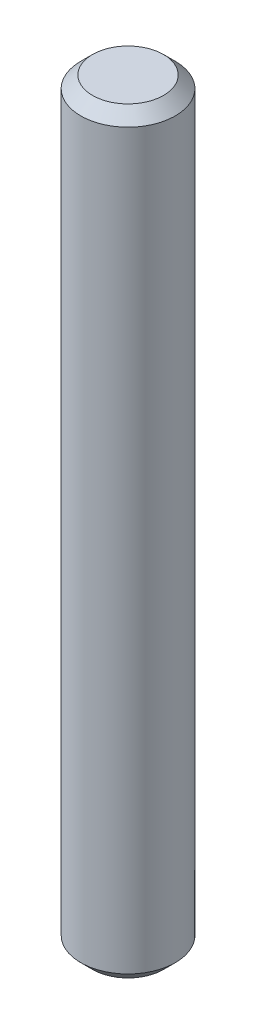
ISO-10303-21;
HEADER;
FILE_DESCRIPTION(('STEP AP214'),'2;1');
FILE_NAME('part.step','',(''),(''),'','','');
FILE_SCHEMA(('AUTOMOTIVE_DESIGN { 1 0 10303 214 1 1 1 1 }'));
ENDSEC;
DATA;
#1=APPLICATION_CONTEXT('core data for automotive mechanical design processes');
#2=APPLICATION_PROTOCOL_DEFINITION('international standard','automotive_design',2000,#1);
#3=PRODUCT_CONTEXT('',#1,'mechanical');
#4=PRODUCT('Part','Part','',(#3));
#5=PRODUCT_RELATED_PRODUCT_CATEGORY('part','',(#4));
#6=PRODUCT_DEFINITION_FORMATION('','',#4);
#7=PRODUCT_DEFINITION_CONTEXT('part definition',#1,'design');
#8=PRODUCT_DEFINITION('design','',#6,#7);
#9=PRODUCT_DEFINITION_SHAPE('','',#8);
#10=(LENGTH_UNIT() NAMED_UNIT(*) SI_UNIT(.MILLI.,.METRE.));
#11=(NAMED_UNIT(*) PLANE_ANGLE_UNIT() SI_UNIT($,.RADIAN.));
#12=(NAMED_UNIT(*) SI_UNIT($,.STERADIAN.) SOLID_ANGLE_UNIT());
#13=UNCERTAINTY_MEASURE_WITH_UNIT(LENGTH_MEASURE(1.E-05),#10,'distance_accuracy_value','');
#14=(GEOMETRIC_REPRESENTATION_CONTEXT(3) GLOBAL_UNCERTAINTY_ASSIGNED_CONTEXT((#13)) GLOBAL_UNIT_ASSIGNED_CONTEXT((#10,
#11,#12)) REPRESENTATION_CONTEXT('',''));
#15=CARTESIAN_POINT('',(0.,0.,0.));
#16=DIRECTION('',(0.,0.,1.));
#17=DIRECTION('',(1.,0.,0.));
#18=AXIS2_PLACEMENT_3D('',#15,#16,#17);
#19=CARTESIAN_POINT('',(0.,12.7,0.));
#20=DIRECTION('',(0.,-1.,0.));
#21=DIRECTION('',(0.,0.,-1.));
#22=AXIS2_PLACEMENT_3D('',#19,#20,#21);
#23=CONICAL_SURFACE('',#22,1.19126,0.785398163397448);
#24=CARTESIAN_POINT('',(0.,12.30376,0.));
#25=DIRECTION('',(0.,-1.,0.));
#26=DIRECTION('',(0.,0.,-1.));
#27=AXIS2_PLACEMENT_3D('',#24,#25,#26);
#28=CIRCLE('',#27,1.5875);
#29=CARTESIAN_POINT('',(0.,12.30376,-1.5875));
#30=VERTEX_POINT('',#29);
#31=EDGE_CURVE('E11',#30,#30,#28,.T.);
#32=ORIENTED_EDGE('',*,*,#31,.F.);
#33=EDGE_LOOP('',(#32));
#34=FACE_BOUND('',#33,.T.);
#35=CARTESIAN_POINT('',(0.,12.7,0.));
#36=DIRECTION('',(0.,-1.,0.));
#37=DIRECTION('',(0.,0.,-1.));
#38=AXIS2_PLACEMENT_3D('',#35,#36,#37);
#39=CIRCLE('',#38,1.19126);
#40=CARTESIAN_POINT('',(0.,12.7,-1.19126));
#41=VERTEX_POINT('',#40);
#42=EDGE_CURVE('E242',#41,#41,#39,.T.);
#43=ORIENTED_EDGE('',*,*,#42,.T.);
#44=EDGE_LOOP('',(#43));
#45=FACE_BOUND('',#44,.T.);
#46=ADVANCED_FACE('F223',(#34,#45),#23,.T.);
#47=CARTESIAN_POINT('',(0.,-12.7,0.));
#48=DIRECTION('',(0.,-1.,0.));
#49=DIRECTION('',(0.,0.,-1.));
#50=AXIS2_PLACEMENT_3D('',#47,#48,#49);
#51=CYLINDRICAL_SURFACE('',#50,1.5875);
#52=CARTESIAN_POINT('',(0.,-12.30376,0.));
#53=DIRECTION('',(0.,-1.,0.));
#54=DIRECTION('',(0.,0.,-1.));
#55=AXIS2_PLACEMENT_3D('',#52,#53,#54);
#56=CIRCLE('',#55,1.5875);
#57=CARTESIAN_POINT('',(0.,-12.30376,-1.5875));
#58=VERTEX_POINT('',#57);
#59=EDGE_CURVE('E229',#58,#58,#56,.T.);
#60=ORIENTED_EDGE('',*,*,#59,.F.);
#61=EDGE_LOOP('',(#60));
#62=FACE_BOUND('',#61,.T.);
#63=ORIENTED_EDGE('',*,*,#31,.T.);
#64=EDGE_LOOP('',(#63));
#65=FACE_BOUND('',#64,.T.);
#66=ADVANCED_FACE('F265',(#62,#65),#51,.T.);
#67=CARTESIAN_POINT('',(0.,-12.30376,0.));
#68=DIRECTION('',(0.,1.,0.));
#69=DIRECTION('',(0.,0.,1.));
#70=AXIS2_PLACEMENT_3D('',#67,#68,#69);
#71=CONICAL_SURFACE('',#70,1.5875,0.78539816339745);
#72=CARTESIAN_POINT('',(0.,-12.7,0.));
#73=DIRECTION('',(0.,-1.,0.));
#74=DIRECTION('',(0.,0.,-1.));
#75=AXIS2_PLACEMENT_3D('',#72,#73,#74);
#76=CIRCLE('',#75,1.19126);
#77=CARTESIAN_POINT('',(0.,-12.7,-1.19126));
#78=VERTEX_POINT('',#77);
#79=EDGE_CURVE('E237',#78,#78,#76,.T.);
#80=ORIENTED_EDGE('',*,*,#79,.F.);
#81=EDGE_LOOP('',(#80));
#82=FACE_BOUND('',#81,.T.);
#83=ORIENTED_EDGE('',*,*,#59,.T.);
#84=EDGE_LOOP('',(#83));
#85=FACE_BOUND('',#84,.T.);
#86=ADVANCED_FACE('F256',(#82,#85),#71,.T.);
#87=CARTESIAN_POINT('',(0.,-12.7,0.));
#88=DIRECTION('',(0.,1.,0.));
#89=DIRECTION('',(0.,0.,1.));
#90=AXIS2_PLACEMENT_3D('',#87,#88,#89);
#91=PLANE('',#90);
#92=ORIENTED_EDGE('',*,*,#79,.T.);
#93=EDGE_LOOP('',(#92));
#94=FACE_BOUND('',#93,.T.);
#95=ADVANCED_FACE('F254',(#94),#91,.F.);
#96=CARTESIAN_POINT('',(0.,12.7,1.19126));
#97=DIRECTION('',(0.,-1.,0.));
#98=DIRECTION('',(0.,0.,-1.));
#99=AXIS2_PLACEMENT_3D('',#96,#97,#98);
#100=PLANE('',#99);
#101=ORIENTED_EDGE('',*,*,#42,.F.);
#102=EDGE_LOOP('',(#101));
#103=FACE_BOUND('',#102,.T.);
#104=ADVANCED_FACE('F251',(#103),#100,.F.);
#105=CLOSED_SHELL('',(#46,#66,#86,#95,#104));
#106=MANIFOLD_SOLID_BREP('B2',#105);
#107=ADVANCED_BREP_SHAPE_REPRESENTATION('',(#18,#106),#14);
#108=SHAPE_DEFINITION_REPRESENTATION(#9,#107);
ENDSEC;
END-ISO-10303-21;
